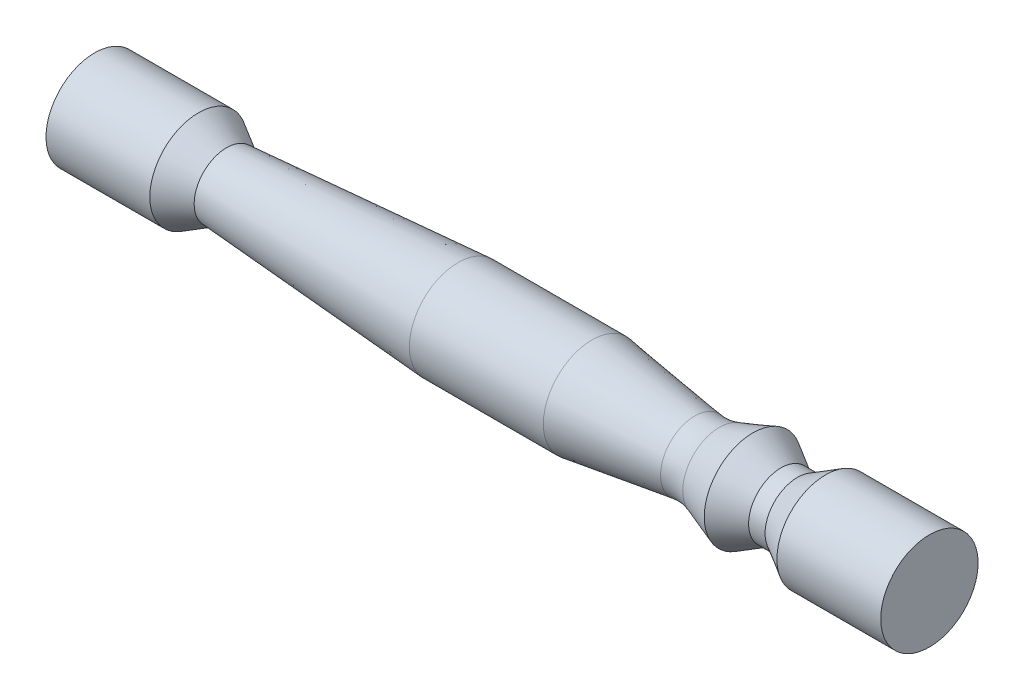
ISO-10303-21;
HEADER;
FILE_DESCRIPTION(('STEP AP214'),'2;1');
FILE_NAME('part.step','',(''),(''),'','','');
FILE_SCHEMA(('AUTOMOTIVE_DESIGN { 1 0 10303 214 1 1 1 1 }'));
ENDSEC;
DATA;
#1=APPLICATION_CONTEXT('core data for automotive mechanical design processes');
#2=APPLICATION_PROTOCOL_DEFINITION('international standard','automotive_design',2000,#1);
#3=PRODUCT_CONTEXT('',#1,'mechanical');
#4=PRODUCT('Part','Part','',(#3));
#5=PRODUCT_RELATED_PRODUCT_CATEGORY('part','',(#4));
#6=PRODUCT_DEFINITION_FORMATION('','',#4);
#7=PRODUCT_DEFINITION_CONTEXT('part definition',#1,'design');
#8=PRODUCT_DEFINITION('design','',#6,#7);
#9=PRODUCT_DEFINITION_SHAPE('','',#8);
#10=(LENGTH_UNIT() NAMED_UNIT(*) SI_UNIT(.MILLI.,.METRE.));
#11=(NAMED_UNIT(*) PLANE_ANGLE_UNIT() SI_UNIT($,.RADIAN.));
#12=(NAMED_UNIT(*) SI_UNIT($,.STERADIAN.) SOLID_ANGLE_UNIT());
#13=UNCERTAINTY_MEASURE_WITH_UNIT(LENGTH_MEASURE(1.E-05),#10,'distance_accuracy_value','');
#14=(GEOMETRIC_REPRESENTATION_CONTEXT(3) GLOBAL_UNCERTAINTY_ASSIGNED_CONTEXT((#13)) GLOBAL_UNIT_ASSIGNED_CONTEXT((#10,
#11,#12)) REPRESENTATION_CONTEXT('',''));
#15=CARTESIAN_POINT('',(0.,0.,0.));
#16=DIRECTION('',(0.,0.,1.));
#17=DIRECTION('',(1.,0.,0.));
#18=AXIS2_PLACEMENT_3D('',#15,#16,#17);
#19=CARTESIAN_POINT('',(-40.8432,4.7625,0.));
#20=DIRECTION('',(1.,0.,0.));
#21=DIRECTION('',(0.,0.,-1.));
#22=AXIS2_PLACEMENT_3D('',#19,#20,#21);
#23=PLANE('',#22);
#24=CARTESIAN_POINT('',(-40.8432,0.,0.));
#25=DIRECTION('',(-1.,0.,0.));
#26=DIRECTION('',(0.,0.,1.));
#27=AXIS2_PLACEMENT_3D('',#24,#25,#26);
#28=CIRCLE('',#27,4.7625);
#29=CARTESIAN_POINT('',(-40.8432,0.,4.7625));
#30=VERTEX_POINT('',#29);
#31=EDGE_CURVE('E76',#30,#30,#28,.T.);
#32=ORIENTED_EDGE('',*,*,#31,.T.);
#33=EDGE_LOOP('',(#32));
#34=FACE_BOUND('',#33,.T.);
#35=ADVANCED_FACE('F35',(#34),#23,.F.);
#36=CARTESIAN_POINT('',(40.8432,0.,0.));
#37=DIRECTION('',(-1.,0.,0.));
#38=DIRECTION('',(0.,0.,1.));
#39=AXIS2_PLACEMENT_3D('',#36,#37,#38);
#40=PLANE('',#39);
#41=CARTESIAN_POINT('',(40.8432,0.,0.));
#42=DIRECTION('',(-1.,0.,0.));
#43=DIRECTION('',(0.,0.,1.));
#44=AXIS2_PLACEMENT_3D('',#41,#42,#43);
#45=CIRCLE('',#44,4.7625);
#46=CARTESIAN_POINT('',(40.8432,0.,4.7625));
#47=VERTEX_POINT('',#46);
#48=EDGE_CURVE('E46',#47,#47,#45,.T.);
#49=ORIENTED_EDGE('',*,*,#48,.F.);
#50=EDGE_LOOP('',(#49));
#51=FACE_BOUND('',#50,.T.);
#52=ADVANCED_FACE('F116',(#51),#40,.F.);
#53=CARTESIAN_POINT('',(-40.8432,0.,0.));
#54=DIRECTION('',(-1.,0.,0.));
#55=DIRECTION('',(0.,0.,1.));
#56=AXIS2_PLACEMENT_3D('',#53,#54,#55);
#57=CYLINDRICAL_SURFACE('',#56,4.76250000000001);
#58=CARTESIAN_POINT('',(30.6832,0.,0.));
#59=DIRECTION('',(-1.,0.,0.));
#60=DIRECTION('',(0.,0.,1.));
#61=AXIS2_PLACEMENT_3D('',#58,#59,#60);
#62=CIRCLE('',#61,4.76250000000001);
#63=CARTESIAN_POINT('',(30.6832,0.,4.76250000000001));
#64=VERTEX_POINT('',#63);
#65=EDGE_CURVE('E50',#64,#64,#62,.T.);
#66=ORIENTED_EDGE('',*,*,#65,.F.);
#67=EDGE_LOOP('',(#66));
#68=FACE_BOUND('',#67,.T.);
#69=ORIENTED_EDGE('',*,*,#48,.T.);
#70=EDGE_LOOP('',(#69));
#71=FACE_BOUND('',#70,.T.);
#72=ADVANCED_FACE('F120',(#68,#71),#57,.T.);
#73=CARTESIAN_POINT('',(30.6832,0.,0.));
#74=DIRECTION('',(1.,0.,0.));
#75=DIRECTION('',(0.,0.,-1.));
#76=AXIS2_PLACEMENT_3D('',#73,#74,#75);
#77=CONICAL_SURFACE('',#76,4.76250000000001,0.523598775598294);
#78=CARTESIAN_POINT('',(27.9335693429843,0.,0.));
#79=DIRECTION('',(-1.,0.,0.));
#80=DIRECTION('',(0.,0.,1.));
#81=AXIS2_PLACEMENT_3D('',#78,#79,#80);
#82=CIRCLE('',#81,3.17499999999999);
#83=CARTESIAN_POINT('',(27.9335693429843,0.,3.17499999999999));
#84=VERTEX_POINT('',#83);
#85=EDGE_CURVE('E55',#84,#84,#82,.T.);
#86=ORIENTED_EDGE('',*,*,#85,.F.);
#87=EDGE_LOOP('',(#86));
#88=FACE_BOUND('',#87,.T.);
#89=ORIENTED_EDGE('',*,*,#65,.T.);
#90=EDGE_LOOP('',(#89));
#91=FACE_BOUND('',#90,.T.);
#92=ADVANCED_FACE('F126',(#88,#91),#77,.T.);
#93=CARTESIAN_POINT('',(-40.8432,0.,0.));
#94=DIRECTION('',(-1.,0.,0.));
#95=DIRECTION('',(0.,0.,1.));
#96=AXIS2_PLACEMENT_3D('',#93,#94,#95);
#97=CYLINDRICAL_SURFACE('',#96,3.17499999999999);
#98=CARTESIAN_POINT('',(26.3208306570156,0.,0.));
#99=DIRECTION('',(-1.,0.,0.));
#100=DIRECTION('',(0.,0.,1.));
#101=AXIS2_PLACEMENT_3D('',#98,#99,#100);
#102=CIRCLE('',#101,3.17499999999999);
#103=CARTESIAN_POINT('',(26.3208306570156,0.,3.17499999999999));
#104=VERTEX_POINT('',#103);
#105=EDGE_CURVE('E58',#104,#104,#102,.T.);
#106=ORIENTED_EDGE('',*,*,#105,.F.);
#107=EDGE_LOOP('',(#106));
#108=FACE_BOUND('',#107,.T.);
#109=ORIENTED_EDGE('',*,*,#85,.T.);
#110=EDGE_LOOP('',(#109));
#111=FACE_BOUND('',#110,.T.);
#112=ADVANCED_FACE('F130',(#108,#111),#97,.T.);
#113=CARTESIAN_POINT('',(26.3208306570156,0.,0.));
#114=DIRECTION('',(-1.,0.,0.));
#115=DIRECTION('',(0.,0.,1.));
#116=AXIS2_PLACEMENT_3D('',#113,#114,#115);
#117=CONICAL_SURFACE('',#116,3.17499999999999,0.523598775598295);
#118=CARTESIAN_POINT('',(23.5712,0.,0.));
#119=DIRECTION('',(-1.,0.,0.));
#120=DIRECTION('',(0.,0.,1.));
#121=AXIS2_PLACEMENT_3D('',#118,#119,#120);
#122=CIRCLE('',#121,4.76250000000001);
#123=CARTESIAN_POINT('',(23.5712,0.,4.76250000000001));
#124=VERTEX_POINT('',#123);
#125=EDGE_CURVE('E61',#124,#124,#122,.T.);
#126=ORIENTED_EDGE('',*,*,#125,.F.);
#127=EDGE_LOOP('',(#126));
#128=FACE_BOUND('',#127,.T.);
#129=ORIENTED_EDGE('',*,*,#105,.T.);
#130=EDGE_LOOP('',(#129));
#131=FACE_BOUND('',#130,.T.);
#132=ADVANCED_FACE('F113',(#128,#131),#117,.T.);
#133=CARTESIAN_POINT('',(23.5712,0.,0.));
#134=DIRECTION('',(1.,0.,0.));
#135=DIRECTION('',(0.,0.,-1.));
#136=AXIS2_PLACEMENT_3D('',#133,#134,#135);
#137=CONICAL_SURFACE('',#136,4.76250000000001,0.342500920470887);
#138=CARTESIAN_POINT('',(20.2952002358726,0.,0.));
#139=DIRECTION('',(1.,0.,0.));
#140=DIRECTION('',(0.,0.,-1.));
#141=AXIS2_PLACEMENT_3D('',#138,#139,#140);
#142=CIRCLE('',#141,3.59443168444566);
#143=CARTESIAN_POINT('',(20.2952002358726,0.,-3.59443168444566));
#144=VERTEX_POINT('',#143);
#145=EDGE_CURVE('E10',#144,#144,#142,.T.);
#146=ORIENTED_EDGE('',*,*,#145,.T.);
#147=EDGE_LOOP('',(#146));
#148=FACE_BOUND('',#147,.T.);
#149=ORIENTED_EDGE('',*,*,#125,.T.);
#150=EDGE_LOOP('',(#149));
#151=FACE_BOUND('',#150,.T.);
#152=ADVANCED_FACE('F107',(#148,#151),#137,.T.);
#153=CARTESIAN_POINT('',(19.1188494342849,0.,0.));
#154=DIRECTION('',(-1.,0.,0.));
#155=DIRECTION('',(0.,0.,1.));
#156=AXIS2_PLACEMENT_3D('',#153,#154,#155);
#157=CONICAL_SURFACE('',#156,3.17499999999999,0.139626340159547);
#158=CARTESIAN_POINT('',(17.8821143728442,0.,0.));
#159=DIRECTION('',(-1.,0.,0.));
#160=DIRECTION('',(0.,0.,1.));
#161=AXIS2_PLACEMENT_3D('',#158,#159,#160);
#162=CIRCLE('',#161,3.34881177784059);
#163=CARTESIAN_POINT('',(17.8821143728442,0.,3.34881177784059));
#164=VERTEX_POINT('',#163);
#165=EDGE_CURVE('E42',#164,#164,#162,.T.);
#166=ORIENTED_EDGE('',*,*,#165,.T.);
#167=EDGE_LOOP('',(#166));
#168=FACE_BOUND('',#167,.T.);
#169=CARTESIAN_POINT('',(7.8232,0.,0.));
#170=DIRECTION('',(-1.,0.,0.));
#171=DIRECTION('',(0.,0.,1.));
#172=AXIS2_PLACEMENT_3D('',#169,#170,#171);
#173=CIRCLE('',#172,4.7625);
#174=CARTESIAN_POINT('',(7.8232,0.,4.7625));
#175=VERTEX_POINT('',#174);
#176=EDGE_CURVE('E64',#175,#175,#173,.T.);
#177=ORIENTED_EDGE('',*,*,#176,.F.);
#178=EDGE_LOOP('',(#177));
#179=FACE_BOUND('',#178,.T.);
#180=ADVANCED_FACE('F102',(#168,#179),#157,.T.);
#181=CARTESIAN_POINT('',(-40.8432,0.,0.));
#182=DIRECTION('',(-1.,0.,0.));
#183=DIRECTION('',(0.,0.,1.));
#184=AXIS2_PLACEMENT_3D('',#181,#182,#183);
#185=CYLINDRICAL_SURFACE('',#184,4.7625);
#186=CARTESIAN_POINT('',(-5.28320000000001,0.,0.));
#187=DIRECTION('',(-1.,0.,0.));
#188=DIRECTION('',(0.,0.,1.));
#189=AXIS2_PLACEMENT_3D('',#186,#187,#188);
#190=CIRCLE('',#189,4.7625);
#191=CARTESIAN_POINT('',(-5.28320000000001,0.,4.7625));
#192=VERTEX_POINT('',#191);
#193=EDGE_CURVE('E67',#192,#192,#190,.T.);
#194=ORIENTED_EDGE('',*,*,#193,.F.);
#195=EDGE_LOOP('',(#194));
#196=FACE_BOUND('',#195,.T.);
#197=ORIENTED_EDGE('',*,*,#176,.T.);
#198=EDGE_LOOP('',(#197));
#199=FACE_BOUND('',#198,.T.);
#200=ADVANCED_FACE('F96',(#196,#199),#185,.T.);
#201=CARTESIAN_POINT('',(-5.28320000000001,0.,0.));
#202=DIRECTION('',(1.,0.,0.));
#203=DIRECTION('',(0.,0.,-1.));
#204=AXIS2_PLACEMENT_3D('',#201,#202,#203);
#205=CONICAL_SURFACE('',#204,4.7625,0.06997273346149);
#206=CARTESIAN_POINT('',(-27.9335693429844,0.,0.));
#207=DIRECTION('',(-1.,0.,0.));
#208=DIRECTION('',(0.,0.,1.));
#209=AXIS2_PLACEMENT_3D('',#206,#207,#208);
#210=CIRCLE('',#209,3.175);
#211=CARTESIAN_POINT('',(-27.9335693429844,0.,3.175));
#212=VERTEX_POINT('',#211);
#213=EDGE_CURVE('E70',#212,#212,#210,.T.);
#214=ORIENTED_EDGE('',*,*,#213,.F.);
#215=EDGE_LOOP('',(#214));
#216=FACE_BOUND('',#215,.T.);
#217=ORIENTED_EDGE('',*,*,#193,.T.);
#218=EDGE_LOOP('',(#217));
#219=FACE_BOUND('',#218,.T.);
#220=ADVANCED_FACE('F90',(#216,#219),#205,.T.);
#221=CARTESIAN_POINT('',(-27.9335693429844,0.,0.));
#222=DIRECTION('',(-1.,0.,0.));
#223=DIRECTION('',(0.,0.,1.));
#224=AXIS2_PLACEMENT_3D('',#221,#222,#223);
#225=CONICAL_SURFACE('',#224,3.175,0.523598775598293);
#226=CARTESIAN_POINT('',(-30.6832,0.,0.));
#227=DIRECTION('',(-1.,0.,0.));
#228=DIRECTION('',(0.,0.,1.));
#229=AXIS2_PLACEMENT_3D('',#226,#227,#228);
#230=CIRCLE('',#229,4.7625);
#231=CARTESIAN_POINT('',(-30.6832,0.,4.7625));
#232=VERTEX_POINT('',#231);
#233=EDGE_CURVE('E73',#232,#232,#230,.T.);
#234=ORIENTED_EDGE('',*,*,#233,.F.);
#235=EDGE_LOOP('',(#234));
#236=FACE_BOUND('',#235,.T.);
#237=ORIENTED_EDGE('',*,*,#213,.T.);
#238=EDGE_LOOP('',(#237));
#239=FACE_BOUND('',#238,.T.);
#240=ADVANCED_FACE('F84',(#236,#239),#225,.T.);
#241=CARTESIAN_POINT('',(-40.8432,0.,0.));
#242=DIRECTION('',(-1.,0.,0.));
#243=DIRECTION('',(0.,0.,1.));
#244=AXIS2_PLACEMENT_3D('',#241,#242,#243);
#245=CYLINDRICAL_SURFACE('',#244,4.7625);
#246=ORIENTED_EDGE('',*,*,#31,.F.);
#247=EDGE_LOOP('',(#246));
#248=FACE_BOUND('',#247,.T.);
#249=ORIENTED_EDGE('',*,*,#233,.T.);
#250=EDGE_LOOP('',(#249));
#251=FACE_BOUND('',#250,.T.);
#252=ADVANCED_FACE('F81',(#248,#251),#245,.T.);
#253=CARTESIAN_POINT('',(18.5891137257213,0.,0.));
#254=DIRECTION('',(-1.,0.,0.));
#255=DIRECTION('',(0.,0.,1.));
#256=AXIS2_PLACEMENT_3D('',#253,#254,#255);
#257=TOROIDAL_SURFACE('',#256,8.37937356704777,5.08);
#258=ORIENTED_EDGE('',*,*,#145,.F.);
#259=EDGE_LOOP('',(#258));
#260=FACE_BOUND('',#259,.T.);
#261=ORIENTED_EDGE('',*,*,#165,.F.);
#262=EDGE_LOOP('',(#261));
#263=FACE_BOUND('',#262,.T.);
#264=ADVANCED_FACE('F37',(#260,#263),#257,.F.);
#265=CLOSED_SHELL('',(#35,#52,#72,#92,#112,#132,#152,#180,#200,#220,#240,#252,#264));
#266=MANIFOLD_SOLID_BREP('B2',#265);
#267=ADVANCED_BREP_SHAPE_REPRESENTATION('',(#18,#266),#14);
#268=SHAPE_DEFINITION_REPRESENTATION(#9,#267);
ENDSEC;
END-ISO-10303-21;
